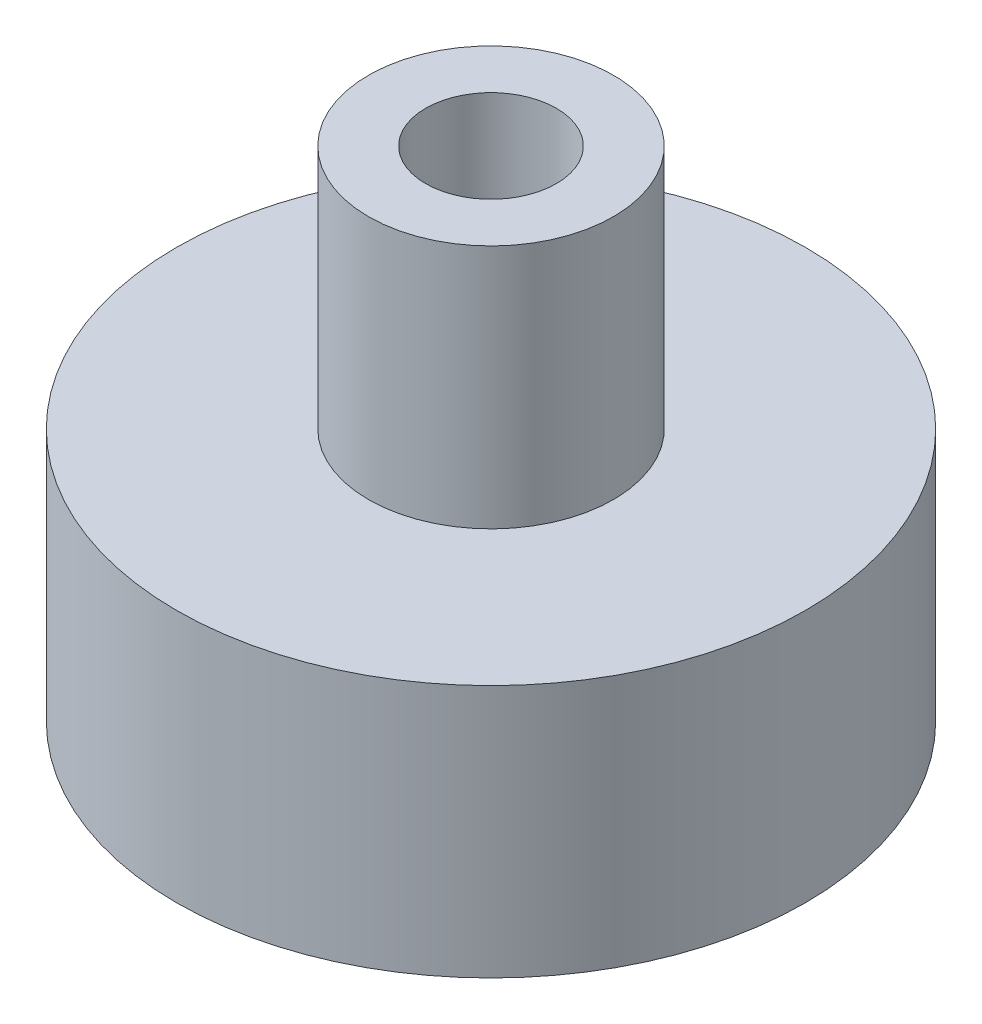
ISO-10303-21;
HEADER;
FILE_DESCRIPTION(('STEP AP214'),'2;1');
FILE_NAME('part.step','',(''),(''),'','','');
FILE_SCHEMA(('AUTOMOTIVE_DESIGN { 1 0 10303 214 1 1 1 1 }'));
ENDSEC;
DATA;
#1=APPLICATION_CONTEXT('core data for automotive mechanical design processes');
#2=APPLICATION_PROTOCOL_DEFINITION('international standard','automotive_design',2000,#1);
#3=PRODUCT_CONTEXT('',#1,'mechanical');
#4=PRODUCT('Part','Part','',(#3));
#5=PRODUCT_RELATED_PRODUCT_CATEGORY('part','',(#4));
#6=PRODUCT_DEFINITION_FORMATION('','',#4);
#7=PRODUCT_DEFINITION_CONTEXT('part definition',#1,'design');
#8=PRODUCT_DEFINITION('design','',#6,#7);
#9=PRODUCT_DEFINITION_SHAPE('','',#8);
#10=(LENGTH_UNIT() NAMED_UNIT(*) SI_UNIT(.MILLI.,.METRE.));
#11=(NAMED_UNIT(*) PLANE_ANGLE_UNIT() SI_UNIT($,.RADIAN.));
#12=(NAMED_UNIT(*) SI_UNIT($,.STERADIAN.) SOLID_ANGLE_UNIT());
#13=UNCERTAINTY_MEASURE_WITH_UNIT(LENGTH_MEASURE(1.E-05),#10,'distance_accuracy_value','');
#14=(GEOMETRIC_REPRESENTATION_CONTEXT(3) GLOBAL_UNCERTAINTY_ASSIGNED_CONTEXT((#13)) GLOBAL_UNIT_ASSIGNED_CONTEXT((#10,
#11,#12)) REPRESENTATION_CONTEXT('',''));
#15=CARTESIAN_POINT('',(0.,0.,0.));
#16=DIRECTION('',(0.,0.,1.));
#17=DIRECTION('',(1.,0.,0.));
#18=AXIS2_PLACEMENT_3D('',#15,#16,#17);
#19=CARTESIAN_POINT('',(0.,6.1,0.));
#20=DIRECTION('',(0.,-1.,0.));
#21=DIRECTION('',(0.,0.,-1.));
#22=AXIS2_PLACEMENT_3D('',#19,#20,#21);
#23=CYLINDRICAL_SURFACE('',#22,0.8);
#24=CARTESIAN_POINT('',(0.,6.1,0.));
#25=DIRECTION('',(0.,1.,0.));
#26=DIRECTION('',(0.,0.,1.));
#27=AXIS2_PLACEMENT_3D('',#24,#25,#26);
#28=CIRCLE('',#27,0.8);
#29=CARTESIAN_POINT('',(0.,6.1,0.8));
#30=VERTEX_POINT('',#29);
#31=EDGE_CURVE('E52',#30,#30,#28,.T.);
#32=ORIENTED_EDGE('',*,*,#31,.T.);
#33=EDGE_LOOP('',(#32));
#34=FACE_BOUND('',#33,.T.);
#35=CARTESIAN_POINT('',(0.,2.2,0.));
#36=DIRECTION('',(0.,-1.,0.));
#37=DIRECTION('',(0.,0.,-1.));
#38=AXIS2_PLACEMENT_3D('',#35,#36,#37);
#39=CIRCLE('',#38,0.8);
#40=CARTESIAN_POINT('',(0.,2.2,-0.8));
#41=VERTEX_POINT('',#40);
#42=EDGE_CURVE('E38',#41,#41,#39,.T.);
#43=ORIENTED_EDGE('',*,*,#42,.T.);
#44=EDGE_LOOP('',(#43));
#45=FACE_BOUND('',#44,.T.);
#46=ADVANCED_FACE('F34',(#34,#45),#23,.F.);
#47=CARTESIAN_POINT('',(0.,3.1,0.));
#48=DIRECTION('',(0.,-1.,0.));
#49=DIRECTION('',(0.,0.,-1.));
#50=AXIS2_PLACEMENT_3D('',#47,#48,#49);
#51=CYLINDRICAL_SURFACE('',#50,3.85);
#52=CARTESIAN_POINT('',(0.,3.1,0.));
#53=DIRECTION('',(0.,1.,0.));
#54=DIRECTION('',(0.,0.,1.));
#55=AXIS2_PLACEMENT_3D('',#52,#53,#54);
#56=CIRCLE('',#55,3.85);
#57=CARTESIAN_POINT('',(0.,3.1,-3.85));
#58=VERTEX_POINT('',#57);
#59=EDGE_CURVE('E10',#58,#58,#56,.T.);
#60=CARTESIAN_POINT('',(0.,0.,0.));
#61=DIRECTION('',(0.,1.,0.));
#62=DIRECTION('',(0.,0.,1.));
#63=AXIS2_PLACEMENT_3D('',#60,#61,#62);
#64=CIRCLE('',#63,3.85);
#65=CARTESIAN_POINT('',(0.,0.,-3.85));
#66=VERTEX_POINT('',#65);
#67=EDGE_CURVE('E42',#66,#66,#64,.T.);
#68=CARTESIAN_POINT('',(0.,3.1,-3.85));
#69=CARTESIAN_POINT('',(0.,3.06770833333333,-3.85));
#70=CARTESIAN_POINT('',(0.,3.03541666666667,-3.85));
#71=CARTESIAN_POINT('',(0.,2.97083333333333,-3.85));
#72=CARTESIAN_POINT('',(0.,2.93854166666667,-3.85));
#73=CARTESIAN_POINT('',(0.,2.87395833333333,-3.85));
#74=CARTESIAN_POINT('',(0.,2.84166666666667,-3.85));
#75=CARTESIAN_POINT('',(0.,2.77708333333333,-3.85));
#76=CARTESIAN_POINT('',(0.,2.74479166666667,-3.85));
#77=CARTESIAN_POINT('',(0.,2.68020833333333,-3.85));
#78=CARTESIAN_POINT('',(0.,2.64791666666667,-3.85));
#79=CARTESIAN_POINT('',(0.,2.58333333333333,-3.85));
#80=CARTESIAN_POINT('',(0.,2.55104166666667,-3.85));
#81=CARTESIAN_POINT('',(0.,2.48645833333333,-3.85));
#82=CARTESIAN_POINT('',(0.,2.45416666666667,-3.85));
#83=CARTESIAN_POINT('',(0.,2.38958333333333,-3.85));
#84=CARTESIAN_POINT('',(0.,2.35729166666667,-3.85));
#85=CARTESIAN_POINT('',(0.,2.29270833333333,-3.85));
#86=CARTESIAN_POINT('',(0.,2.26041666666667,-3.85));
#87=CARTESIAN_POINT('',(0.,2.19583333333333,-3.85));
#88=CARTESIAN_POINT('',(0.,2.16354166666667,-3.85));
#89=CARTESIAN_POINT('',(0.,2.09895833333333,-3.85));
#90=CARTESIAN_POINT('',(0.,2.06666666666667,-3.85));
#91=CARTESIAN_POINT('',(0.,2.00208333333333,-3.85));
#92=CARTESIAN_POINT('',(0.,1.96979166666667,-3.85));
#93=CARTESIAN_POINT('',(0.,1.90520833333333,-3.85));
#94=CARTESIAN_POINT('',(0.,1.87291666666667,-3.85));
#95=CARTESIAN_POINT('',(0.,1.80833333333333,-3.85));
#96=CARTESIAN_POINT('',(0.,1.77604166666667,-3.85));
#97=CARTESIAN_POINT('',(0.,1.71145833333333,-3.85));
#98=CARTESIAN_POINT('',(0.,1.67916666666667,-3.85));
#99=CARTESIAN_POINT('',(0.,1.61458333333333,-3.85));
#100=CARTESIAN_POINT('',(0.,1.58229166666667,-3.85));
#101=CARTESIAN_POINT('',(0.,1.51770833333333,-3.85));
#102=CARTESIAN_POINT('',(0.,1.48541666666667,-3.85));
#103=CARTESIAN_POINT('',(0.,1.42083333333333,-3.85));
#104=CARTESIAN_POINT('',(0.,1.38854166666667,-3.85));
#105=CARTESIAN_POINT('',(0.,1.32395833333333,-3.85));
#106=CARTESIAN_POINT('',(0.,1.29166666666667,-3.85));
#107=CARTESIAN_POINT('',(0.,1.22708333333333,-3.85));
#108=CARTESIAN_POINT('',(0.,1.19479166666667,-3.85));
#109=CARTESIAN_POINT('',(0.,1.13020833333333,-3.85));
#110=CARTESIAN_POINT('',(0.,1.09791666666667,-3.85));
#111=CARTESIAN_POINT('',(0.,1.03333333333333,-3.85));
#112=CARTESIAN_POINT('',(0.,1.00104166666667,-3.85));
#113=CARTESIAN_POINT('',(0.,0.936458333333333,-3.85));
#114=CARTESIAN_POINT('',(0.,0.904166666666667,-3.85));
#115=CARTESIAN_POINT('',(0.,0.839583333333334,-3.85));
#116=CARTESIAN_POINT('',(0.,0.807291666666667,-3.85));
#117=CARTESIAN_POINT('',(0.,0.742708333333333,-3.85));
#118=CARTESIAN_POINT('',(0.,0.710416666666667,-3.85));
#119=CARTESIAN_POINT('',(0.,0.645833333333333,-3.85));
#120=CARTESIAN_POINT('',(0.,0.613541666666667,-3.85));
#121=CARTESIAN_POINT('',(0.,0.548958333333333,-3.85));
#122=CARTESIAN_POINT('',(0.,0.516666666666667,-3.85));
#123=CARTESIAN_POINT('',(0.,0.452083333333333,-3.85));
#124=CARTESIAN_POINT('',(0.,0.419791666666667,-3.85));
#125=CARTESIAN_POINT('',(0.,0.355208333333333,-3.85));
#126=CARTESIAN_POINT('',(0.,0.322916666666667,-3.85));
#127=CARTESIAN_POINT('',(0.,0.258333333333333,-3.85));
#128=CARTESIAN_POINT('',(0.,0.226041666666667,-3.85));
#129=CARTESIAN_POINT('',(0.,0.161458333333333,-3.85));
#130=CARTESIAN_POINT('',(0.,0.129166666666667,-3.85));
#131=CARTESIAN_POINT('',(0.,0.0645833333333335,-3.85));
#132=CARTESIAN_POINT('',(0.,0.0322916666666667,-3.85));
#133=CARTESIAN_POINT('',(0.,0.,-3.85));
#134=B_SPLINE_CURVE_WITH_KNOTS('',3,(#68,#69,#70,#71,#72,#73,#74,#75,#76,#77,#78,#79,#80,#81,
#82,#83,#84,#85,#86,#87,#88,#89,#90,#91,#92,#93,#94,#95,#96,#97,#98,#99,#100,#101,#102,#103,
#104,#105,#106,#107,#108,#109,#110,#111,#112,#113,#114,#115,#116,#117,#118,#119,#120,#121,#122,
#123,#124,#125,#126,#127,#128,#129,#130,#131,#132,#133),.UNSPECIFIED.,.F.,.F.,(4,2,2,2,2,2,2,2,
2,2,2,2,2,2,2,2,2,2,2,2,2,2,2,2,2,2,2,2,2,2,2,2,4),(0.,0.0968750000000002,0.19375,0.290625,
0.3875,0.484375,0.58125,0.678125,0.775,0.871875,0.96875,1.065625,1.1625,1.259375,1.35625,
1.453125,1.55,1.646875,1.74375,1.840625,1.9375,2.034375,2.13125,2.228125,2.325,2.421875,2.51875,
2.615625,2.7125,2.809375,2.90625,3.003125,3.1),.UNSPECIFIED.);
#135=EDGE_CURVE('BSEAM36',#58,#66,#134,.T.);
#136=ORIENTED_EDGE('',*,*,#59,.F.);
#137=ORIENTED_EDGE('',*,*,#67,.T.);
#138=ORIENTED_EDGE('',*,*,#135,.T.);
#139=ORIENTED_EDGE('',*,*,#135,.F.);
#140=EDGE_LOOP('',(#136,#138,#137,#139));
#141=FACE_BOUND('',#140,.T.);
#142=ADVANCED_FACE('F36',(#141),#51,.T.);
#143=CARTESIAN_POINT('',(0.,3.1,0.));
#144=DIRECTION('',(0.,1.,0.));
#145=DIRECTION('',(0.,0.,1.));
#146=AXIS2_PLACEMENT_3D('',#143,#144,#145);
#147=PLANE('',#146);
#148=CARTESIAN_POINT('',(0.,3.1,0.));
#149=DIRECTION('',(0.,1.,0.));
#150=DIRECTION('',(0.,0.,1.));
#151=AXIS2_PLACEMENT_3D('',#148,#149,#150);
#152=CIRCLE('',#151,1.5);
#153=CARTESIAN_POINT('',(0.,3.1,1.5));
#154=VERTEX_POINT('',#153);
#155=EDGE_CURVE('E49',#154,#154,#152,.T.);
#156=ORIENTED_EDGE('',*,*,#155,.F.);
#157=EDGE_LOOP('',(#156));
#158=FACE_BOUND('',#157,.T.);
#159=ORIENTED_EDGE('',*,*,#59,.T.);
#160=EDGE_LOOP('',(#159));
#161=FACE_BOUND('',#160,.T.);
#162=ADVANCED_FACE('F84',(#158,#161),#147,.T.);
#163=CARTESIAN_POINT('',(0.,0.,0.));
#164=DIRECTION('',(0.,1.,0.));
#165=DIRECTION('',(0.,0.,1.));
#166=AXIS2_PLACEMENT_3D('',#163,#164,#165);
#167=PLANE('',#166);
#168=CARTESIAN_POINT('',(0.,0.,0.));
#169=DIRECTION('',(0.,-1.,0.));
#170=DIRECTION('',(0.,0.,-1.));
#171=AXIS2_PLACEMENT_3D('',#168,#169,#170);
#172=CIRCLE('',#171,2.65);
#173=CARTESIAN_POINT('',(0.,0.,-2.65));
#174=VERTEX_POINT('',#173);
#175=EDGE_CURVE('E57',#174,#174,#172,.T.);
#176=ORIENTED_EDGE('',*,*,#175,.F.);
#177=EDGE_LOOP('',(#176));
#178=FACE_BOUND('',#177,.T.);
#179=ORIENTED_EDGE('',*,*,#67,.F.);
#180=EDGE_LOOP('',(#179));
#181=FACE_BOUND('',#180,.T.);
#182=ADVANCED_FACE('F90',(#178,#181),#167,.F.);
#183=CARTESIAN_POINT('',(0.,6.1,0.));
#184=DIRECTION('',(0.,1.,0.));
#185=DIRECTION('',(0.,0.,1.));
#186=AXIS2_PLACEMENT_3D('',#183,#184,#185);
#187=PLANE('',#186);
#188=CARTESIAN_POINT('',(0.,6.1,0.));
#189=DIRECTION('',(0.,1.,0.));
#190=DIRECTION('',(0.,0.,1.));
#191=AXIS2_PLACEMENT_3D('',#188,#189,#190);
#192=CIRCLE('',#191,1.5);
#193=CARTESIAN_POINT('',(0.,6.1,1.5));
#194=VERTEX_POINT('',#193);
#195=EDGE_CURVE('E47',#194,#194,#192,.T.);
#196=ORIENTED_EDGE('',*,*,#195,.T.);
#197=EDGE_LOOP('',(#196));
#198=FACE_BOUND('',#197,.T.);
#199=ORIENTED_EDGE('',*,*,#31,.F.);
#200=EDGE_LOOP('',(#199));
#201=FACE_BOUND('',#200,.T.);
#202=ADVANCED_FACE('F87',(#198,#201),#187,.T.);
#203=CARTESIAN_POINT('',(0.,6.1,0.));
#204=DIRECTION('',(0.,-1.,0.));
#205=DIRECTION('',(0.,0.,-1.));
#206=AXIS2_PLACEMENT_3D('',#203,#204,#205);
#207=CYLINDRICAL_SURFACE('',#206,1.5);
#208=ORIENTED_EDGE('',*,*,#195,.F.);
#209=EDGE_LOOP('',(#208));
#210=FACE_BOUND('',#209,.T.);
#211=ORIENTED_EDGE('',*,*,#155,.T.);
#212=EDGE_LOOP('',(#211));
#213=FACE_BOUND('',#212,.T.);
#214=ADVANCED_FACE('F75',(#210,#213),#207,.T.);
#215=CARTESIAN_POINT('',(0.,2.2,0.));
#216=DIRECTION('',(0.,-1.,0.));
#217=DIRECTION('',(0.,0.,-1.));
#218=AXIS2_PLACEMENT_3D('',#215,#216,#217);
#219=CYLINDRICAL_SURFACE('',#218,2.65);
#220=CARTESIAN_POINT('',(0.,2.2,0.));
#221=DIRECTION('',(0.,-1.,0.));
#222=DIRECTION('',(0.,0.,-1.));
#223=AXIS2_PLACEMENT_3D('',#220,#221,#222);
#224=CIRCLE('',#223,2.65);
#225=CARTESIAN_POINT('',(0.,2.2,-2.65));
#226=VERTEX_POINT('',#225);
#227=EDGE_CURVE('E60',#226,#226,#224,.T.);
#228=ORIENTED_EDGE('',*,*,#227,.F.);
#229=EDGE_LOOP('',(#228));
#230=FACE_BOUND('',#229,.T.);
#231=ORIENTED_EDGE('',*,*,#175,.T.);
#232=EDGE_LOOP('',(#231));
#233=FACE_BOUND('',#232,.T.);
#234=ADVANCED_FACE('F70',(#230,#233),#219,.F.);
#235=CARTESIAN_POINT('',(0.,2.2,0.));
#236=DIRECTION('',(0.,-1.,0.));
#237=DIRECTION('',(0.,0.,-1.));
#238=AXIS2_PLACEMENT_3D('',#235,#236,#237);
#239=PLANE('',#238);
#240=ORIENTED_EDGE('',*,*,#42,.F.);
#241=EDGE_LOOP('',(#240));
#242=FACE_BOUND('',#241,.T.);
#243=ORIENTED_EDGE('',*,*,#227,.T.);
#244=EDGE_LOOP('',(#243));
#245=FACE_BOUND('',#244,.T.);
#246=ADVANCED_FACE('F68',(#242,#245),#239,.T.);
#247=CLOSED_SHELL('',(#46,#142,#162,#182,#202,#214,#234,#246));
#248=MANIFOLD_SOLID_BREP('B2',#247);
#249=ADVANCED_BREP_SHAPE_REPRESENTATION('',(#18,#248),#14);
#250=SHAPE_DEFINITION_REPRESENTATION(#9,#249);
ENDSEC;
END-ISO-10303-21;
